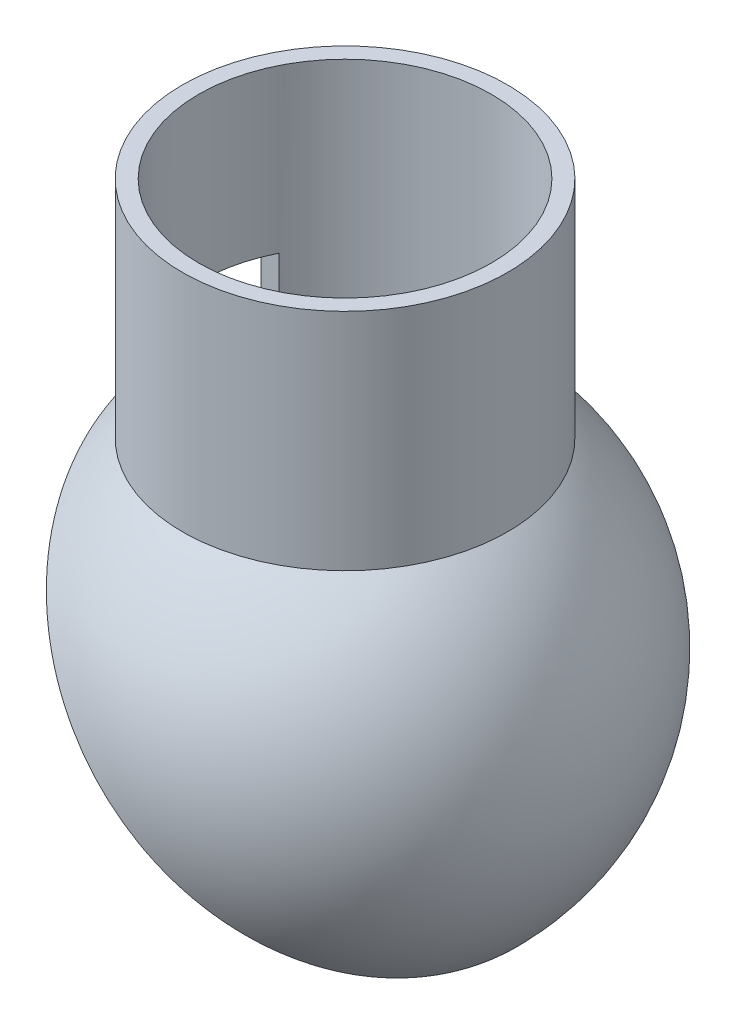
ISO-10303-21;
HEADER;
FILE_DESCRIPTION(('STEP AP214'),'2;1');
FILE_NAME('part.step','',(''),(''),'','','');
FILE_SCHEMA(('AUTOMOTIVE_DESIGN { 1 0 10303 214 1 1 1 1 }'));
ENDSEC;
DATA;
#1=APPLICATION_CONTEXT('core data for automotive mechanical design processes');
#2=APPLICATION_PROTOCOL_DEFINITION('international standard','automotive_design',2000,#1);
#3=PRODUCT_CONTEXT('',#1,'mechanical');
#4=PRODUCT('Part','Part','',(#3));
#5=PRODUCT_RELATED_PRODUCT_CATEGORY('part','',(#4));
#6=PRODUCT_DEFINITION_FORMATION('','',#4);
#7=PRODUCT_DEFINITION_CONTEXT('part definition',#1,'design');
#8=PRODUCT_DEFINITION('design','',#6,#7);
#9=PRODUCT_DEFINITION_SHAPE('','',#8);
#10=(LENGTH_UNIT() NAMED_UNIT(*) SI_UNIT(.MILLI.,.METRE.));
#11=(NAMED_UNIT(*) PLANE_ANGLE_UNIT() SI_UNIT($,.RADIAN.));
#12=(NAMED_UNIT(*) SI_UNIT($,.STERADIAN.) SOLID_ANGLE_UNIT());
#13=UNCERTAINTY_MEASURE_WITH_UNIT(LENGTH_MEASURE(1.E-05),#10,'distance_accuracy_value','');
#14=(GEOMETRIC_REPRESENTATION_CONTEXT(3) GLOBAL_UNCERTAINTY_ASSIGNED_CONTEXT((#13)) GLOBAL_UNIT_ASSIGNED_CONTEXT((#10,
#11,#12)) REPRESENTATION_CONTEXT('',''));
#15=CARTESIAN_POINT('',(0.,0.,0.));
#16=DIRECTION('',(0.,0.,1.));
#17=DIRECTION('',(1.,0.,0.));
#18=AXIS2_PLACEMENT_3D('',#15,#16,#17);
#19=CARTESIAN_POINT('',(0.,0.,0.));
#20=DIRECTION('',(0.,1.,0.));
#21=DIRECTION('',(-1.,0.,0.));
#22=AXIS2_PLACEMENT_3D('',#19,#20,#21);
#23=SPHERICAL_SURFACE('',#22,15.);
#24=CARTESIAN_POINT('',(0.,11.1803398874989,0.));
#25=DIRECTION('',(0.,1.,0.));
#26=DIRECTION('',(-1.,0.,0.));
#27=AXIS2_PLACEMENT_3D('',#24,#25,#26);
#28=CIRCLE('',#27,9.99999999999999);
#29=CARTESIAN_POINT('',(-10.,11.1803398874989,0.));
#30=VERTEX_POINT('',#29);
#31=EDGE_CURVE('E102',#30,#30,#28,.T.);
#32=CARTESIAN_POINT('',(0.,0.,0.));
#33=DIRECTION('',(-0.707106781186544,-0.707106781186551,0.));
#34=DIRECTION('',(0.707106781186551,-0.707106781186544,0.));
#35=AXIS2_PLACEMENT_3D('',#32,#33,#34);
#36=CIRCLE('',#35,15.);
#37=CARTESIAN_POINT('',(-10.6066017177983,10.6066017177982,0.));
#38=VERTEX_POINT('',#37);
#39=EDGE_CURVE('E105',#38,#38,#36,.F.);
#40=CARTESIAN_POINT('',(-10.,11.1803398874989,0.));
#41=CARTESIAN_POINT('',(-10.0064834915875,11.1745408763415,0.));
#42=CARTESIAN_POINT('',(-10.0129619388847,11.168736225496,0.));
#43=CARTESIAN_POINT('',(-10.025908725315,11.1571156620239,0.));
#44=CARTESIAN_POINT('',(-10.0323770644481,11.1512997493974,0.));
#45=CARTESIAN_POINT('',(-10.045303614967,11.1396566799584,0.));
#46=CARTESIAN_POINT('',(-10.0517618263528,11.1338295231459,0.));
#47=CARTESIAN_POINT('',(-10.0646681018324,11.1221639829732,0.));
#48=CARTESIAN_POINT('',(-10.0711161659264,11.1163255996129,0.));
#49=CARTESIAN_POINT('',(-10.0840021273064,11.1046376240144,0.));
#50=CARTESIAN_POINT('',(-10.0904400245925,11.0987880317761,0.));
#51=CARTESIAN_POINT('',(-10.1033056328723,11.0870776561258,0.));
#52=CARTESIAN_POINT('',(-10.109733343866,11.0812168727139,0.));
#53=CARTESIAN_POINT('',(-10.122578560107,11.0694841324542,0.));
#54=CARTESIAN_POINT('',(-10.1289960653543,11.0636121756066,0.));
#55=CARTESIAN_POINT('',(-10.1418208506797,11.0518571062474,0.));
#56=CARTESIAN_POINT('',(-10.1482281307577,11.045973993736,0.));
#57=CARTESIAN_POINT('',(-10.1610324463523,11.0341966308549,0.));
#58=CARTESIAN_POINT('',(-10.1674294818689,11.0283023804852,0.));
#59=CARTESIAN_POINT('',(-10.1802132889796,11.0165027597271,0.));
#60=CARTESIAN_POINT('',(-10.1866000605738,11.0105973893387,0.));
#61=CARTESIAN_POINT('',(-10.1993633205096,10.9987755464159,0.));
#62=CARTESIAN_POINT('',(-10.2057398088513,10.9928590738817,0.));
#63=CARTESIAN_POINT('',(-10.2184824829833,10.9810150445739,0.));
#64=CARTESIAN_POINT('',(-10.2248486687736,10.9750874878003,0.));
#65=CARTESIAN_POINT('',(-10.2375707185353,10.9632213079542,0.));
#66=CARTESIAN_POINT('',(-10.2439265825067,10.9572826848816,0.));
#67=CARTESIAN_POINT('',(-10.2566279693939,10.945394390411,0.));
#68=CARTESIAN_POINT('',(-10.2629734923098,10.939444719013,0.));
#69=CARTESIAN_POINT('',(-10.2756541778809,10.9275343458985,0.));
#70=CARTESIAN_POINT('',(-10.2819893405362,10.9215736441821,0.));
#71=CARTESIAN_POINT('',(-10.2946492864123,10.9096412284715,0.));
#72=CARTESIAN_POINT('',(-10.3009740696332,10.9036695144772,0.));
#73=CARTESIAN_POINT('',(-10.3136132374981,10.8917150922845,0.));
#74=CARTESIAN_POINT('',(-10.3199276221422,10.8857323840861,0.));
#75=CARTESIAN_POINT('',(-10.3325459737426,10.8737559915922,0.));
#76=CARTESIAN_POINT('',(-10.338849940699,10.8677623072968,0.));
#77=CARTESIAN_POINT('',(-10.3514474378447,10.8557639807492,0.));
#78=CARTESIAN_POINT('',(-10.357740968034,10.849759338497,0.));
#79=CARTESIAN_POINT('',(-10.3703175725978,10.8377391142093,0.));
#80=CARTESIAN_POINT('',(-10.3766006469723,10.8317235321738,0.));
#81=CARTESIAN_POINT('',(-10.3891563208901,10.8196814465261,0.));
#82=CARTESIAN_POINT('',(-10.3954289204336,10.8136549429139,0.));
#83=CARTESIAN_POINT('',(-10.407963625705,10.8015910323523,0.));
#84=CARTESIAN_POINT('',(-10.414225731433,10.795553625403,0.));
#85=CARTESIAN_POINT('',(-10.4267394301209,10.7834679264398,0.));
#86=CARTESIAN_POINT('',(-10.4329910230807,10.777419634426,0.));
#87=CARTESIAN_POINT('',(-10.4454836773115,10.7653121836393,0.));
#88=CARTESIAN_POINT('',(-10.4517247385823,10.7592530248665,0.));
#89=CARTESIAN_POINT('',(-10.4641963105461,10.7471238589005,0.));
#90=CARTESIAN_POINT('',(-10.4704268212389,10.7410538517072,0.));
#91=CARTESIAN_POINT('',(-10.4828772731896,10.7289030072714,0.));
#92=CARTESIAN_POINT('',(-10.4890972144475,10.7228221700289,0.));
#93=CARTESIAN_POINT('',(-10.501526508703,10.7106496838988,0.));
#94=CARTESIAN_POINT('',(-10.5077358617007,10.7045580350111,0.));
#95=CARTESIAN_POINT('',(-10.520143960643,10.6923639440275,0.));
#96=CARTESIAN_POINT('',(-10.5263427065876,10.6862615019315,0.));
#97=CARTESIAN_POINT('',(-10.5387295726627,10.6740458430006,0.));
#98=CARTESIAN_POINT('',(-10.5449176927931,10.6679326261655,0.));
#99=CARTESIAN_POINT('',(-10.5572832885116,10.6556954362591,0.));
#100=CARTESIAN_POINT('',(-10.5634607640996,10.6495714631876,0.));
#101=CARTESIAN_POINT('',(-10.5758050520348,10.637312779341,0.));
#102=CARTESIAN_POINT('',(-10.581971864382,10.6311780685658,0.));
#103=CARTESIAN_POINT('',(-10.5942948071782,10.6188979278858,0.));
#104=CARTESIAN_POINT('',(-10.6004509376271,10.6127524979809,0.));
#105=CARTESIAN_POINT('',(-10.6066017177983,10.6066017177982,0.));
#106=B_SPLINE_CURVE_WITH_KNOTS('',3,(#40,#41,#42,#43,#44,#45,#46,#47,#48,#49,#50,#51,#52,#53,
#54,#55,#56,#57,#58,#59,#60,#61,#62,#63,#64,#65,#66,#67,#68,#69,#70,#71,#72,#73,#74,#75,#76,#77,
#78,#79,#80,#81,#82,#83,#84,#85,#86,#87,#88,#89,#90,#91,#92,#93,#94,#95,#96,#97,#98,#99,#100,
#101,#102,#103,#104,#105),.UNSPECIFIED.,.F.,.F.,(4,2,2,2,2,2,2,2,2,2,2,2,2,2,2,2,2,2,2,2,2,2,2,
2,2,2,2,2,2,2,2,2,4),(0.,0.0260955469453334,0.0521910938906696,0.0782866408360025,
0.10438218778134,0.130477734726674,0.156573281672007,0.182668828617344,0.20876437556268,
0.234859922508014,0.260955469453349,0.287051016398682,0.313146563344016,0.339242110289352,
0.365337657234688,0.391433204180024,0.417528751125358,0.443624298070693,0.469719845016026,
0.495815391961362,0.521910938906698,0.548006485852032,0.574102032797366,0.600197579742702,
0.626293126688037,0.65238867363337,0.678484220578707,0.704579767524041,0.730675314469375,
0.75677086141471,0.782866408360045,0.80896195530538,0.835057502250716),.UNSPECIFIED.);
#107=EDGE_CURVE('BSEAM33',#30,#38,#106,.T.);
#108=ORIENTED_EDGE('',*,*,#31,.F.);
#109=ORIENTED_EDGE('',*,*,#39,.T.);
#110=ORIENTED_EDGE('',*,*,#107,.T.);
#111=ORIENTED_EDGE('',*,*,#107,.F.);
#112=EDGE_LOOP('',(#108,#110,#109,#111));
#113=FACE_BOUND('',#112,.T.);
#114=ADVANCED_FACE('F33',(#113),#23,.T.);
#115=CARTESIAN_POINT('',(0.,25.,0.));
#116=DIRECTION('',(0.,1.,0.));
#117=DIRECTION('',(-1.,0.,0.));
#118=AXIS2_PLACEMENT_3D('',#115,#116,#117);
#119=CYLINDRICAL_SURFACE('',#118,10.);
#120=DIRECTION('',(0.,1.,0.));
#121=VECTOR('',#120,1.);
#122=CARTESIAN_POINT('',(-9.16515138991168,25.,4.));
#123=LINE('',#122,#121);
#124=CARTESIAN_POINT('',(-9.16515138991168,12.,4.));
#125=VERTEX_POINT('',#124);
#126=CARTESIAN_POINT('',(-9.16515138991168,15.,4.));
#127=VERTEX_POINT('',#126);
#128=EDGE_CURVE('E81',#125,#127,#123,.T.);
#129=ORIENTED_EDGE('',*,*,#128,.F.);
#130=CARTESIAN_POINT('',(0.,12.,0.));
#131=DIRECTION('',(0.,-1.,0.));
#132=DIRECTION('',(0.,0.,-1.));
#133=AXIS2_PLACEMENT_3D('',#130,#131,#132);
#134=CIRCLE('',#133,10.);
#135=CARTESIAN_POINT('',(-9.16515138991168,12.,-4.));
#136=VERTEX_POINT('',#135);
#137=EDGE_CURVE('E71',#136,#125,#134,.F.);
#138=ORIENTED_EDGE('',*,*,#137,.F.);
#139=DIRECTION('',(0.,1.,0.));
#140=VECTOR('',#139,1.);
#141=CARTESIAN_POINT('',(-9.16515138991168,25.,-4.));
#142=LINE('',#141,#140);
#143=CARTESIAN_POINT('',(-9.16515138991168,15.,-4.));
#144=VERTEX_POINT('',#143);
#145=EDGE_CURVE('E76',#144,#136,#142,.F.);
#146=ORIENTED_EDGE('',*,*,#145,.F.);
#147=CARTESIAN_POINT('',(0.,15.,0.));
#148=DIRECTION('',(0.,1.,0.));
#149=DIRECTION('',(0.,0.,1.));
#150=AXIS2_PLACEMENT_3D('',#147,#148,#149);
#151=CIRCLE('',#150,10.);
#152=EDGE_CURVE('E88',#127,#144,#151,.F.);
#153=ORIENTED_EDGE('',*,*,#152,.F.);
#154=EDGE_LOOP('',(#129,#138,#146,#153));
#155=FACE_BOUND('',#154,.T.);
#156=ORIENTED_EDGE('',*,*,#31,.T.);
#157=EDGE_LOOP('',(#156));
#158=FACE_BOUND('',#157,.T.);
#159=CARTESIAN_POINT('',(0.,25.,0.));
#160=DIRECTION('',(0.,1.,0.));
#161=DIRECTION('',(-1.,0.,0.));
#162=AXIS2_PLACEMENT_3D('',#159,#160,#161);
#163=CIRCLE('',#162,10.);
#164=CARTESIAN_POINT('',(-10.,25.,0.));
#165=VERTEX_POINT('',#164);
#166=EDGE_CURVE('E98',#165,#165,#163,.T.);
#167=ORIENTED_EDGE('',*,*,#166,.F.);
#168=EDGE_LOOP('',(#167));
#169=FACE_BOUND('',#168,.T.);
#170=ADVANCED_FACE('F35',(#155,#158,#169),#119,.T.);
#171=CARTESIAN_POINT('',(0.,25.,0.));
#172=DIRECTION('',(0.,1.,0.));
#173=DIRECTION('',(-1.,0.,0.));
#174=AXIS2_PLACEMENT_3D('',#171,#172,#173);
#175=PLANE('',#174);
#176=CARTESIAN_POINT('',(0.,25.,0.));
#177=DIRECTION('',(0.,1.,0.));
#178=DIRECTION('',(-1.,0.,0.));
#179=AXIS2_PLACEMENT_3D('',#176,#177,#178);
#180=CIRCLE('',#179,9.);
#181=CARTESIAN_POINT('',(-9.,25.,0.));
#182=VERTEX_POINT('',#181);
#183=EDGE_CURVE('E89',#182,#182,#180,.T.);
#184=ORIENTED_EDGE('',*,*,#183,.F.);
#185=EDGE_LOOP('',(#184));
#186=FACE_BOUND('',#185,.T.);
#187=ORIENTED_EDGE('',*,*,#166,.T.);
#188=EDGE_LOOP('',(#187));
#189=FACE_BOUND('',#188,.T.);
#190=ADVANCED_FACE('F139',(#186,#189),#175,.T.);
#191=CARTESIAN_POINT('',(0.,0.,-15.));
#192=DIRECTION('',(-0.707106781186544,-0.707106781186551,0.));
#193=DIRECTION('',(0.707106781186551,-0.707106781186544,0.));
#194=AXIS2_PLACEMENT_3D('',#191,#192,#193);
#195=PLANE('',#194);
#196=ORIENTED_EDGE('',*,*,#39,.F.);
#197=EDGE_LOOP('',(#196));
#198=FACE_BOUND('',#197,.T.);
#199=ADVANCED_FACE('F145',(#198),#195,.T.);
#200=CARTESIAN_POINT('',(0.,10.,0.));
#201=DIRECTION('',(0.,1.,0.));
#202=DIRECTION('',(-1.,0.,0.));
#203=AXIS2_PLACEMENT_3D('',#200,#201,#202);
#204=CYLINDRICAL_SURFACE('',#203,9.);
#205=CARTESIAN_POINT('',(0.,12.,0.));
#206=DIRECTION('',(0.,-1.,0.));
#207=DIRECTION('',(0.,0.,-1.));
#208=AXIS2_PLACEMENT_3D('',#205,#206,#207);
#209=CIRCLE('',#208,9.);
#210=CARTESIAN_POINT('',(-8.06225774829855,12.,-4.));
#211=VERTEX_POINT('',#210);
#212=CARTESIAN_POINT('',(-8.06225774829855,12.,4.));
#213=VERTEX_POINT('',#212);
#214=EDGE_CURVE('E108',#211,#213,#209,.F.);
#215=ORIENTED_EDGE('',*,*,#214,.T.);
#216=DIRECTION('',(0.,1.,0.));
#217=VECTOR('',#216,1.);
#218=CARTESIAN_POINT('',(-8.06225774829855,10.,4.));
#219=LINE('',#218,#217);
#220=CARTESIAN_POINT('',(-8.06225774829855,15.,4.));
#221=VERTEX_POINT('',#220);
#222=EDGE_CURVE('E11',#213,#221,#219,.T.);
#223=ORIENTED_EDGE('',*,*,#222,.T.);
#224=CARTESIAN_POINT('',(0.,15.,0.));
#225=DIRECTION('',(0.,1.,0.));
#226=DIRECTION('',(0.,0.,1.));
#227=AXIS2_PLACEMENT_3D('',#224,#225,#226);
#228=CIRCLE('',#227,9.);
#229=CARTESIAN_POINT('',(-8.06225774829855,15.,-4.));
#230=VERTEX_POINT('',#229);
#231=EDGE_CURVE('E41',#221,#230,#228,.F.);
#232=ORIENTED_EDGE('',*,*,#231,.T.);
#233=DIRECTION('',(0.,1.,0.));
#234=VECTOR('',#233,1.);
#235=CARTESIAN_POINT('',(-8.06225774829855,10.,-4.));
#236=LINE('',#235,#234);
#237=EDGE_CURVE('E110',#230,#211,#236,.F.);
#238=ORIENTED_EDGE('',*,*,#237,.T.);
#239=EDGE_LOOP('',(#215,#223,#232,#238));
#240=FACE_BOUND('',#239,.T.);
#241=CARTESIAN_POINT('',(0.,10.,0.));
#242=DIRECTION('',(0.,1.,0.));
#243=DIRECTION('',(-1.,0.,0.));
#244=AXIS2_PLACEMENT_3D('',#241,#242,#243);
#245=CIRCLE('',#244,9.);
#246=CARTESIAN_POINT('',(-9.,10.,0.));
#247=VERTEX_POINT('',#246);
#248=EDGE_CURVE('E92',#247,#247,#245,.T.);
#249=ORIENTED_EDGE('',*,*,#248,.F.);
#250=EDGE_LOOP('',(#249));
#251=FACE_BOUND('',#250,.T.);
#252=ORIENTED_EDGE('',*,*,#183,.T.);
#253=EDGE_LOOP('',(#252));
#254=FACE_BOUND('',#253,.T.);
#255=ADVANCED_FACE('F114',(#240,#251,#254),#204,.F.);
#256=CARTESIAN_POINT('',(0.,10.,0.));
#257=DIRECTION('',(0.,1.,0.));
#258=DIRECTION('',(-1.,0.,0.));
#259=AXIS2_PLACEMENT_3D('',#256,#257,#258);
#260=PLANE('',#259);
#261=ORIENTED_EDGE('',*,*,#248,.T.);
#262=EDGE_LOOP('',(#261));
#263=FACE_BOUND('',#262,.T.);
#264=ADVANCED_FACE('F152',(#263),#260,.T.);
#265=CARTESIAN_POINT('',(-14.,15.,4.));
#266=DIRECTION('',(0.,0.,1.));
#267=DIRECTION('',(1.,0.,0.));
#268=AXIS2_PLACEMENT_3D('',#265,#266,#267);
#269=PLANE('',#268);
#270=ORIENTED_EDGE('',*,*,#128,.T.);
#271=DIRECTION('',(1.,0.,0.));
#272=VECTOR('',#271,1.);
#273=CARTESIAN_POINT('',(-14.,15.,4.));
#274=LINE('',#273,#272);
#275=EDGE_CURVE('E84',#127,#221,#274,.T.);
#276=ORIENTED_EDGE('',*,*,#275,.T.);
#277=ORIENTED_EDGE('',*,*,#222,.F.);
#278=DIRECTION('',(1.,0.,0.));
#279=VECTOR('',#278,1.);
#280=CARTESIAN_POINT('',(-14.,12.,4.));
#281=LINE('',#280,#279);
#282=EDGE_CURVE('E53',#125,#213,#281,.T.);
#283=ORIENTED_EDGE('',*,*,#282,.F.);
#284=EDGE_LOOP('',(#270,#276,#277,#283));
#285=FACE_BOUND('',#284,.T.);
#286=ADVANCED_FACE('F79',(#285),#269,.F.);
#287=CARTESIAN_POINT('',(-14.,15.,-4.));
#288=DIRECTION('',(0.,1.,0.));
#289=DIRECTION('',(0.,0.,1.));
#290=AXIS2_PLACEMENT_3D('',#287,#288,#289);
#291=PLANE('',#290);
#292=ORIENTED_EDGE('',*,*,#152,.T.);
#293=DIRECTION('',(1.,0.,0.));
#294=VECTOR('',#293,1.);
#295=CARTESIAN_POINT('',(-14.,15.,-4.));
#296=LINE('',#295,#294);
#297=EDGE_CURVE('E120',#144,#230,#296,.T.);
#298=ORIENTED_EDGE('',*,*,#297,.T.);
#299=ORIENTED_EDGE('',*,*,#231,.F.);
#300=ORIENTED_EDGE('',*,*,#275,.F.);
#301=EDGE_LOOP('',(#292,#298,#299,#300));
#302=FACE_BOUND('',#301,.T.);
#303=ADVANCED_FACE('F118',(#302),#291,.F.);
#304=CARTESIAN_POINT('',(-14.,12.,-4.));
#305=DIRECTION('',(0.,0.,-1.));
#306=DIRECTION('',(-1.,0.,0.));
#307=AXIS2_PLACEMENT_3D('',#304,#305,#306);
#308=PLANE('',#307);
#309=ORIENTED_EDGE('',*,*,#145,.T.);
#310=DIRECTION('',(1.,0.,0.));
#311=VECTOR('',#310,1.);
#312=CARTESIAN_POINT('',(-14.,12.,-4.));
#313=LINE('',#312,#311);
#314=EDGE_CURVE('E48',#136,#211,#313,.T.);
#315=ORIENTED_EDGE('',*,*,#314,.T.);
#316=ORIENTED_EDGE('',*,*,#237,.F.);
#317=ORIENTED_EDGE('',*,*,#297,.F.);
#318=EDGE_LOOP('',(#309,#315,#316,#317));
#319=FACE_BOUND('',#318,.T.);
#320=ADVANCED_FACE('F125',(#319),#308,.F.);
#321=CARTESIAN_POINT('',(-14.,12.,0.));
#322=DIRECTION('',(0.,-1.,0.));
#323=DIRECTION('',(0.,0.,-1.));
#324=AXIS2_PLACEMENT_3D('',#321,#322,#323);
#325=PLANE('',#324);
#326=ORIENTED_EDGE('',*,*,#137,.T.);
#327=ORIENTED_EDGE('',*,*,#282,.T.);
#328=ORIENTED_EDGE('',*,*,#214,.F.);
#329=ORIENTED_EDGE('',*,*,#314,.F.);
#330=EDGE_LOOP('',(#326,#327,#328,#329));
#331=FACE_BOUND('',#330,.T.);
#332=ADVANCED_FACE('F72',(#331),#325,.F.);
#333=CLOSED_SHELL('',(#114,#170,#190,#199,#255,#264,#286,#303,#320,#332));
#334=MANIFOLD_SOLID_BREP('B2',#333);
#335=ADVANCED_BREP_SHAPE_REPRESENTATION('',(#18,#334),#14);
#336=SHAPE_DEFINITION_REPRESENTATION(#9,#335);
ENDSEC;
END-ISO-10303-21;
